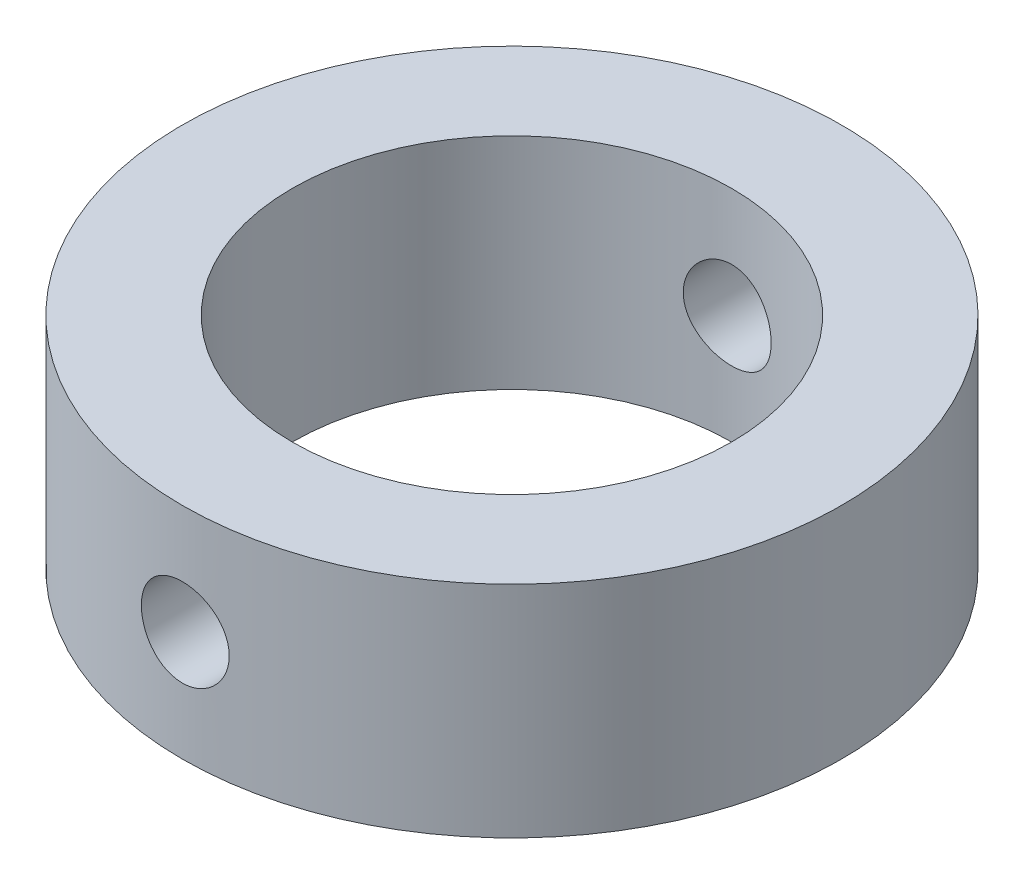
ISO-10303-21;
HEADER;
FILE_DESCRIPTION(('STEP AP214'),'2;1');
FILE_NAME('part.step','',(''),(''),'','','');
FILE_SCHEMA(('AUTOMOTIVE_DESIGN { 1 0 10303 214 1 1 1 1 }'));
ENDSEC;
DATA;
#1=APPLICATION_CONTEXT('core data for automotive mechanical design processes');
#2=APPLICATION_PROTOCOL_DEFINITION('international standard','automotive_design',2000,#1);
#3=PRODUCT_CONTEXT('',#1,'mechanical');
#4=PRODUCT('Part','Part','',(#3));
#5=PRODUCT_RELATED_PRODUCT_CATEGORY('part','',(#4));
#6=PRODUCT_DEFINITION_FORMATION('','',#4);
#7=PRODUCT_DEFINITION_CONTEXT('part definition',#1,'design');
#8=PRODUCT_DEFINITION('design','',#6,#7);
#9=PRODUCT_DEFINITION_SHAPE('','',#8);
#10=(LENGTH_UNIT() NAMED_UNIT(*) SI_UNIT(.MILLI.,.METRE.));
#11=(NAMED_UNIT(*) PLANE_ANGLE_UNIT() SI_UNIT($,.RADIAN.));
#12=(NAMED_UNIT(*) SI_UNIT($,.STERADIAN.) SOLID_ANGLE_UNIT());
#13=UNCERTAINTY_MEASURE_WITH_UNIT(LENGTH_MEASURE(1.E-05),#10,'distance_accuracy_value','');
#14=(GEOMETRIC_REPRESENTATION_CONTEXT(3) GLOBAL_UNCERTAINTY_ASSIGNED_CONTEXT((#13)) GLOBAL_UNIT_ASSIGNED_CONTEXT((#10,
#11,#12)) REPRESENTATION_CONTEXT('',''));
#15=CARTESIAN_POINT('',(0.,0.,0.));
#16=DIRECTION('',(0.,0.,1.));
#17=DIRECTION('',(1.,0.,0.));
#18=AXIS2_PLACEMENT_3D('',#15,#16,#17);
#19=CARTESIAN_POINT('',(0.,15.,0.));
#20=DIRECTION('',(0.,1.,0.));
#21=DIRECTION('',(0.,0.,1.));
#22=AXIS2_PLACEMENT_3D('',#19,#20,#21);
#23=PLANE('',#22);
#24=CARTESIAN_POINT('',(0.,15.,0.));
#25=DIRECTION('',(0.,1.,0.));
#26=DIRECTION('',(0.,0.,1.));
#27=AXIS2_PLACEMENT_3D('',#24,#25,#26);
#28=CIRCLE('',#27,22.5);
#29=CARTESIAN_POINT('',(0.,15.,22.5));
#30=VERTEX_POINT('',#29);
#31=EDGE_CURVE('E10',#30,#30,#28,.T.);
#32=ORIENTED_EDGE('',*,*,#31,.T.);
#33=EDGE_LOOP('',(#32));
#34=FACE_BOUND('',#33,.T.);
#35=CARTESIAN_POINT('',(0.,15.,0.));
#36=DIRECTION('',(0.,1.,0.));
#37=DIRECTION('',(0.,0.,1.));
#38=AXIS2_PLACEMENT_3D('',#35,#36,#37);
#39=CIRCLE('',#38,15.);
#40=CARTESIAN_POINT('',(0.,15.,15.));
#41=VERTEX_POINT('',#40);
#42=EDGE_CURVE('E56',#41,#41,#39,.T.);
#43=ORIENTED_EDGE('',*,*,#42,.F.);
#44=EDGE_LOOP('',(#43));
#45=FACE_BOUND('',#44,.T.);
#46=ADVANCED_FACE('F37',(#34,#45),#23,.T.);
#47=CARTESIAN_POINT('',(0.,0.,0.));
#48=DIRECTION('',(0.,1.,0.));
#49=DIRECTION('',(0.,0.,1.));
#50=AXIS2_PLACEMENT_3D('',#47,#48,#49);
#51=PLANE('',#50);
#52=CARTESIAN_POINT('',(0.,0.,0.));
#53=DIRECTION('',(0.,1.,0.));
#54=DIRECTION('',(0.,0.,1.));
#55=AXIS2_PLACEMENT_3D('',#52,#53,#54);
#56=CIRCLE('',#55,22.5);
#57=CARTESIAN_POINT('',(0.,0.,22.5));
#58=VERTEX_POINT('',#57);
#59=EDGE_CURVE('E51',#58,#58,#56,.T.);
#60=ORIENTED_EDGE('',*,*,#59,.F.);
#61=EDGE_LOOP('',(#60));
#62=FACE_BOUND('',#61,.T.);
#63=CARTESIAN_POINT('',(0.,0.,0.));
#64=DIRECTION('',(0.,1.,0.));
#65=DIRECTION('',(0.,0.,1.));
#66=AXIS2_PLACEMENT_3D('',#63,#64,#65);
#67=CIRCLE('',#66,15.);
#68=CARTESIAN_POINT('',(0.,0.,15.));
#69=VERTEX_POINT('',#68);
#70=EDGE_CURVE('E59',#69,#69,#67,.T.);
#71=ORIENTED_EDGE('',*,*,#70,.T.);
#72=EDGE_LOOP('',(#71));
#73=FACE_BOUND('',#72,.T.);
#74=ADVANCED_FACE('F95',(#62,#73),#51,.F.);
#75=CARTESIAN_POINT('',(0.,15.,0.));
#76=DIRECTION('',(0.,-1.,0.));
#77=DIRECTION('',(0.,0.,-1.));
#78=AXIS2_PLACEMENT_3D('',#75,#76,#77);
#79=CYLINDRICAL_SURFACE('',#78,22.5);
#80=CARTESIAN_POINT('',(0.,10.5,-22.5));
#81=CARTESIAN_POINT('',(-0.167713253503927,10.4999929354396,-22.4999975361382));
#82=CARTESIAN_POINT('',(-0.33552896891442,10.4858886930563,-22.4981050609079));
#83=CARTESIAN_POINT('',(-0.666484087707118,10.4298504764257,-22.4907376669036));
#84=CARTESIAN_POINT('',(-0.829618533499555,10.3878880576543,-22.4852590866258));
#85=CARTESIAN_POINT('',(-1.14637246894048,10.2773974236878,-22.471336197736));
#86=CARTESIAN_POINT('',(-1.29999852458774,10.2088877834423,-22.4628939631646));
#87=CARTESIAN_POINT('',(-1.59354584254545,10.0472896292906,-22.4439807999059));
#88=CARTESIAN_POINT('',(-1.73346930950554,9.95420507825031,-22.4335101983785));
#89=CARTESIAN_POINT('',(-1.99653873375702,9.74548010759372,-22.4116349218495));
#90=CARTESIAN_POINT('',(-2.1195869782438,9.62971703248729,-22.4002253724317));
#91=CARTESIAN_POINT('',(-2.34457103509653,9.37918471638502,-22.3777970633693));
#92=CARTESIAN_POINT('',(-2.44650572995832,9.24441447000629,-22.3667783244351));
#93=CARTESIAN_POINT('',(-2.62673853403361,8.95905131558245,-22.3463315316028));
#94=CARTESIAN_POINT('',(-2.70494411223867,8.80839947628206,-22.3369097664864));
#95=CARTESIAN_POINT('',(-2.83490767510935,8.49595339914482,-22.3207888106885));
#96=CARTESIAN_POINT('',(-2.88666679867917,8.33415964147003,-22.3140895027681));
#97=CARTESIAN_POINT('',(-2.96196910158261,8.00504128424751,-22.30421904853));
#98=CARTESIAN_POINT('',(-2.9856780634276,7.83775524820062,-22.301027180552));
#99=CARTESIAN_POINT('',(-3.00472020822176,7.50155073059107,-22.2984697741397));
#100=CARTESIAN_POINT('',(-3.00005468450402,7.33263232378365,-22.299104061306));
#101=CARTESIAN_POINT('',(-2.96261618908852,6.9991183049581,-22.3041083365948));
#102=CARTESIAN_POINT('',(-2.93002646297642,6.83450170517144,-22.3084539693351));
#103=CARTESIAN_POINT('',(-2.83795086951557,6.51309474485987,-22.3203532916212));
#104=CARTESIAN_POINT('',(-2.77846438892186,6.35630456286748,-22.3279070543119));
#105=CARTESIAN_POINT('',(-2.63408893714787,6.0544355479392,-22.3453989166654));
#106=CARTESIAN_POINT('',(-2.54912096870624,5.90939494320854,-22.3553444118585));
#107=CARTESIAN_POINT('',(-2.35625090016434,5.63556137712351,-22.376493543299));
#108=CARTESIAN_POINT('',(-2.24834760753577,5.50676926116875,-22.3876972449529));
#109=CARTESIAN_POINT('',(-2.01165735039543,5.26802548112715,-22.4102084885038));
#110=CARTESIAN_POINT('',(-1.88271256053967,5.15823023594651,-22.421516153118));
#111=CARTESIAN_POINT('',(-1.60814125520011,4.96181693260741,-22.4428788572739));
#112=CARTESIAN_POINT('',(-1.46251469166355,4.87519894121472,-22.4529338932073));
#113=CARTESIAN_POINT('',(-1.1585883295957,4.72759632345789,-22.4706659061537));
#114=CARTESIAN_POINT('',(-1.00028336826184,4.66662220343053,-22.4783419081343));
#115=CARTESIAN_POINT('',(-0.675556386504373,4.57216602154148,-22.4904423885611));
#116=CARTESIAN_POINT('',(-0.509134799313384,4.53868249404091,-22.4948670403489));
#117=CARTESIAN_POINT('',(-0.174250354988464,4.50036235084332,-22.4999436206528));
#118=CARTESIAN_POINT('',(-0.00581255182056182,4.49531039732477,-22.5006239077357));
#119=CARTESIAN_POINT('',(0.329507425828079,4.51342749619077,-22.4982118730778));
#120=CARTESIAN_POINT('',(0.496389638018499,4.53659586267354,-22.495119643029));
#121=CARTESIAN_POINT('',(0.823220573359409,4.61031698007598,-22.4855276303715));
#122=CARTESIAN_POINT('',(0.98319302476807,4.66076635248323,-22.4790407145438));
#123=CARTESIAN_POINT('',(1.29240764819034,4.78750944890563,-22.4633851388143));
#124=CARTESIAN_POINT('',(1.44164941052346,4.86380415901988,-22.4542163765916));
#125=CARTESIAN_POINT('',(1.72612331792412,5.04058823337497,-22.4341475605511));
#126=CARTESIAN_POINT('',(1.86126872159491,5.14121604857,-22.4232377256857));
#127=CARTESIAN_POINT('',(2.11282942048785,5.36361499383638,-22.4009359306497));
#128=CARTESIAN_POINT('',(2.22924386493568,5.48538708377465,-22.3895439486093));
#129=CARTESIAN_POINT('',(2.44080824134647,5.74756971395933,-22.3674735371027));
#130=CARTESIAN_POINT('',(2.53581491413408,5.88809635010724,-22.3568002316295));
#131=CARTESIAN_POINT('',(2.70087526618221,6.18323911542139,-22.3374619950273));
#132=CARTESIAN_POINT('',(2.7709295026552,6.33785492986557,-22.3287970190518));
#133=CARTESIAN_POINT('',(2.88386754751119,6.65633586304154,-22.3144921767012));
#134=CARTESIAN_POINT('',(2.92683043270193,6.82017252781621,-22.308843513489));
#135=CARTESIAN_POINT('',(2.98462000715938,7.15281544819314,-22.3011862304744));
#136=CARTESIAN_POINT('',(2.99944820140173,7.32162143748665,-22.2991774159701));
#137=CARTESIAN_POINT('',(3.00051728709284,7.65798523628026,-22.2990334694317));
#138=CARTESIAN_POINT('',(2.98698328791739,7.82554236144636,-22.3008678342378));
#139=CARTESIAN_POINT('',(2.93219065030034,8.15597681265581,-22.308137758113));
#140=CARTESIAN_POINT('',(2.89093202224903,8.31885414045297,-22.3135733158325));
#141=CARTESIAN_POINT('',(2.78193465498311,8.63526552487738,-22.3274233540915));
#142=CARTESIAN_POINT('',(2.71420831228562,8.78880391667529,-22.335836439891));
#143=CARTESIAN_POINT('',(2.55422014139606,9.08237382573909,-22.3546956856923));
#144=CARTESIAN_POINT('',(2.46195783945643,9.22240508213407,-22.365141884949));
#145=CARTESIAN_POINT('',(2.25468672764262,9.48613447489262,-22.3869895077459));
#146=CARTESIAN_POINT('',(2.13951040840351,9.6097004216327,-22.3983975863112));
#147=CARTESIAN_POINT('',(1.89003254024735,9.83583482454232,-22.4208257850249));
#148=CARTESIAN_POINT('',(1.75572651109466,9.93839834812538,-22.4318458135347));
#149=CARTESIAN_POINT('',(1.47112948177923,10.1200007076998,-22.4523095270629));
#150=CARTESIAN_POINT('',(1.32077193111594,10.1989359998329,-22.4617461964033));
#151=CARTESIAN_POINT('',(1.00888861438099,10.3303208978176,-22.4779098098846));
#152=CARTESIAN_POINT('',(0.847375018454831,10.3827988629373,-22.4846396538647));
#153=CARTESIAN_POINT('',(0.570882612147626,10.4474220095778,-22.493035826149));
#154=CARTESIAN_POINT('',(0.457636622933667,10.4671098652855,-22.4956344545261));
#155=CARTESIAN_POINT('',(0.229609757424167,10.4934012212482,-22.4991173773616));
#156=CARTESIAN_POINT('',(0.11482889467686,10.5000048369204,-22.500001686942));
#157=CARTESIAN_POINT('',(0.,10.5,-22.5));
#158=B_SPLINE_CURVE_WITH_KNOTS('',3,(#80,#81,#82,#83,#84,#85,#86,#87,#88,#89,#90,#91,#92,#93,
#94,#95,#96,#97,#98,#99,#100,#101,#102,#103,#104,#105,#106,#107,#108,#109,#110,#111,#112,#113,
#114,#115,#116,#117,#118,#119,#120,#121,#122,#123,#124,#125,#126,#127,#128,#129,#130,#131,#132,
#133,#134,#135,#136,#137,#138,#139,#140,#141,#142,#143,#144,#145,#146,#147,#148,#149,#150,#151,
#152,#153,#154,#155,#156,#157),.UNSPECIFIED.,.T.,.F.,(4,2,2,2,2,2,2,2,2,2,2,2,2,2,2,2,2,2,2,2,2,
2,2,2,2,2,2,2,2,2,2,2,2,2,2,2,2,2,4),(0.,0.502720276958615,1.00595464632757,1.50883753924111,
2.01163938846052,2.51723967665338,3.02286671857254,3.53044082267472,4.03799306649307,
4.54253033871538,5.0470446138738,5.54827327647065,6.04951336763776,6.55232374706847,
7.05516027665696,7.56195816727274,8.06875751778444,8.57576430303808,9.08274405587614,
9.58587877488091,10.0890012653172,10.590230450947,11.0914787625532,11.5956491215483,
12.0998423738814,12.6073155680318,13.1147774290957,13.6207511210318,14.1266977467545,
14.6286439124494,15.1305898900312,15.6323010555393,16.1340219089385,16.6395550175266,
17.1452067187674,17.6530429001177,18.1603335748863,18.5045360857096,18.8487355602816),.UNSPECIFIED.);
#159=CARTESIAN_POINT('',(0.,10.5,-22.5));
#160=VERTEX_POINT('',#159);
#161=EDGE_CURVE('E84',#160,#160,#158,.T.);
#162=ORIENTED_EDGE('',*,*,#161,.T.);
#163=EDGE_LOOP('',(#162));
#164=FACE_BOUND('',#163,.T.);
#165=CARTESIAN_POINT('',(3.,7.5,22.2991031209778));
#166=CARTESIAN_POINT('',(2.99999292892183,7.33229421679777,22.2991056676806));
#167=CARTESIAN_POINT('',(2.98588990056203,7.16448595032542,22.3010154696116));
#168=CARTESIAN_POINT('',(2.92985694399183,6.83354630649641,22.3084447289533));
#169=CARTESIAN_POINT('',(2.88789854473666,6.67041989262426,22.3139678794925));
#170=CARTESIAN_POINT('',(2.77741966710399,6.35368294766046,22.3279873821811));
#171=CARTESIAN_POINT('',(2.70891795412568,6.20006578257344,22.3364816334313));
#172=CARTESIAN_POINT('',(2.54733847321029,5.90653338643568,22.3554837337772));
#173=CARTESIAN_POINT('',(2.45426464895203,5.76661596159296,22.3659912596801));
#174=CARTESIAN_POINT('',(2.24555055734277,5.50353981799729,22.3879106598111));
#175=CARTESIAN_POINT('',(2.12978523412289,5.38048070148092,22.399327327406));
#176=CARTESIAN_POINT('',(1.87924384308915,5.15547563181543,22.4217356438735));
#177=CARTESIAN_POINT('',(1.74446679970797,5.05353076278571,22.4327272708986));
#178=CARTESIAN_POINT('',(1.45909758739142,4.87328723742539,22.4530964964055));
#179=CARTESIAN_POINT('',(1.30844765656683,4.79507926606463,22.4624678475342));
#180=CARTESIAN_POINT('',(0.996005724056049,4.6651107537288,22.4784878012371));
#181=CARTESIAN_POINT('',(0.8342141908836,4.61334910143348,22.4851365182189));
#182=CARTESIAN_POINT('',(0.505103062521133,4.5380416356296,22.4949282929341));
#183=CARTESIAN_POINT('',(0.337822085204846,4.51432977748206,22.4980919730761));
#184=CARTESIAN_POINT('',(0.00162750345548431,4.49528008689477,22.5006277195727));
#185=CARTESIAN_POINT('',(-0.167286028083699,4.49994099339522,22.4999999544424));
#186=CARTESIAN_POINT('',(-0.500820186698654,4.53737209581142,22.4950401617536));
#187=CARTESIAN_POINT('',(-0.665461256042677,4.56996369711847,22.4907316700671));
#188=CARTESIAN_POINT('',(-0.986916184068833,4.66205149053226,22.4789208613843));
#189=CARTESIAN_POINT('',(-1.14372987681276,4.72154825275217,22.4714184767105));
#190=CARTESIAN_POINT('',(-1.44562771263619,4.86594516168273,22.4540222850625));
#191=CARTESIAN_POINT('',(-1.59067477402989,4.95092193477462,22.4441212821882));
#192=CARTESIAN_POINT('',(-1.86451753610218,5.14381088592428,22.4230342562856));
#193=CARTESIAN_POINT('',(-1.99331238880023,5.2517242599417,22.4118481662643));
#194=CARTESIAN_POINT('',(-2.23204509231808,5.4884217725384,22.3893388214349));
#195=CARTESIAN_POINT('',(-2.34182855029532,5.61736165229045,22.378015176366));
#196=CARTESIAN_POINT('',(-2.53822039585787,5.89191889705886,22.3565924815386));
#197=CARTESIAN_POINT('',(-2.6248286915453,6.03753632820445,22.3464934366361));
#198=CARTESIAN_POINT('',(-2.7724242912975,6.34146000052005,22.3286636450151));
#199=CARTESIAN_POINT('',(-2.8333981336006,6.49977285677773,22.3209341432218));
#200=CARTESIAN_POINT('',(-2.92785135067386,6.82451703095756,22.3087421319858));
#201=CARTESIAN_POINT('',(-2.96133224031215,6.99094790103985,22.3042794425424));
#202=CARTESIAN_POINT('',(-2.9996424115309,7.32583700250744,22.2991596751552));
#203=CARTESIAN_POINT('',(-3.00468946648218,7.4942698954988,22.2984736726744));
#204=CARTESIAN_POINT('',(-2.98656432283194,7.82957888415711,22.3009083644505));
#205=CARTESIAN_POINT('',(-2.96339281094665,7.99645501760918,22.3040289660712));
#206=CARTESIAN_POINT('',(-2.88967207555529,8.32325397960842,22.3136988065515));
#207=CARTESIAN_POINT('',(-2.8392292548504,8.48320123952715,22.3202347168148));
#208=CARTESIAN_POINT('',(-2.71250767620188,8.79236837017865,22.3359878852161));
#209=CARTESIAN_POINT('',(-2.63622789314075,8.94158781498558,22.3452052497426));
#210=CARTESIAN_POINT('',(-2.45946609625816,9.22604596566122,22.3653516992928));
#211=CARTESIAN_POINT('',(-2.35884184749451,9.36119557255235,22.376290706837));
#212=CARTESIAN_POINT('',(-2.13644748469198,9.61276640765563,22.3986171527477));
#213=CARTESIAN_POINT('',(-2.01467643215631,9.72918680422202,22.410004610999));
#214=CARTESIAN_POINT('',(-1.75249132253736,9.94076483088168,22.43203422983));
#215=CARTESIAN_POINT('',(-1.61196096139879,10.0357789745574,22.4426710507457));
#216=CARTESIAN_POINT('',(-1.31680867847643,10.200852423263,22.4619201221745));
#217=CARTESIAN_POINT('',(-1.16218707377055,10.2709122896342,22.4705324182274));
#218=CARTESIAN_POINT('',(-0.843709158785151,10.3838538923822,22.4847384703673));
#219=CARTESIAN_POINT('',(-0.679882176371044,10.4268171436253,22.4903412723117));
#220=CARTESIAN_POINT('',(-0.347259740134797,10.4846107281915,22.4979347502993));
#221=CARTESIAN_POINT('',(-0.178464543299733,10.4994425140616,22.499925612842));
#222=CARTESIAN_POINT('',(0.157904810567379,10.5005224008605,22.5000697087261));
#223=CARTESIAN_POINT('',(0.325478288882809,10.4869912058916,22.4982525737009));
#224=CARTESIAN_POINT('',(0.655946164578539,10.432198438152,22.4910439982984));
#225=CARTESIAN_POINT('',(0.81884056851161,10.390936904218,22.485652562927));
#226=CARTESIAN_POINT('',(1.13528735188325,10.2819269293851,22.4718983496352));
#227=CARTESIAN_POINT('',(1.28884395231571,10.2141905603882,22.4635369261179));
#228=CARTESIAN_POINT('',(1.58244611794646,10.0541766755311,22.4447662409466));
#229=CARTESIAN_POINT('',(1.72249143359931,9.96189870652016,22.4343569414803));
#230=CARTESIAN_POINT('',(1.98622092909954,9.75460997699573,22.4125543681221));
#231=CARTESIAN_POINT('',(2.10977573574388,9.63943531479568,22.4011543544026));
#232=CARTESIAN_POINT('',(2.33588843381036,9.38996539642449,22.3787079735476));
#233=CARTESIAN_POINT('',(2.43844136296137,9.25566563410142,22.3676616905097));
#234=CARTESIAN_POINT('',(2.62003186467116,8.97107408765783,22.3471216479154));
#235=CARTESIAN_POINT('',(2.69896410641011,8.82071461279206,22.337634925064));
#236=CARTESIAN_POINT('',(2.83034277419568,8.50882729878187,22.3213704974611));
#237=CARTESIAN_POINT('',(2.88281759498929,8.34731164537562,22.3145898900774));
#238=CARTESIAN_POINT('',(2.94743220568238,8.07082758190417,22.3061270075485));
#239=CARTESIAN_POINT('',(2.96711622203802,7.95759259054575,22.3035064293224));
#240=CARTESIAN_POINT('',(2.99340248014674,7.72958773579628,22.2999936221278));
#241=CARTESIAN_POINT('',(3.00000484113448,7.61481788640452,22.2991013774062));
#242=CARTESIAN_POINT('',(3.,7.5,22.2991031209778));
#243=B_SPLINE_CURVE_WITH_KNOTS('',3,(#165,#166,#167,#168,#169,#170,#171,#172,#173,#174,#175,
#176,#177,#178,#179,#180,#181,#182,#183,#184,#185,#186,#187,#188,#189,#190,#191,#192,#193,#194,
#195,#196,#197,#198,#199,#200,#201,#202,#203,#204,#205,#206,#207,#208,#209,#210,#211,#212,#213,
#214,#215,#216,#217,#218,#219,#220,#221,#222,#223,#224,#225,#226,#227,#228,#229,#230,#231,#232,
#233,#234,#235,#236,#237,#238,#239,#240,#241,#242),.UNSPECIFIED.,.T.,.F.,(4,2,2,2,2,2,2,2,2,2,2,
2,2,2,2,2,2,2,2,2,2,2,2,2,2,2,2,2,2,2,2,2,2,2,2,2,2,2,4),(0.,0.502697833875675,1.00591026915852,
1.50876759415237,2.01154426252435,2.51717392681748,3.02282954643357,3.5303933478772,
4.03793581885392,4.54245854287453,5.04695884297285,5.54825713004929,6.04956604000018,
6.55239792684377,7.05525603876943,7.56202372603438,8.06879342278637,8.57582891483612,
9.08283646723653,9.58595553872895,10.0890623667531,10.5902202722789,11.0913980642731,
11.595577922135,12.0997801612593,12.6072676764676,13.1147437751273,13.620685856555,
14.1266018133322,14.6285956478445,15.1305887793096,15.6323532802529,16.1341270467162,
16.6396311355341,17.145254526141,17.6531001297407,18.1603995347189,18.5045691141841,
18.8487355566505),.UNSPECIFIED.);
#244=CARTESIAN_POINT('',(3.,7.5,22.2991031209778));
#245=VERTEX_POINT('',#244);
#246=EDGE_CURVE('E79',#245,#245,#243,.T.);
#247=ORIENTED_EDGE('',*,*,#246,.T.);
#248=EDGE_LOOP('',(#247));
#249=FACE_BOUND('',#248,.T.);
#250=ORIENTED_EDGE('',*,*,#31,.F.);
#251=EDGE_LOOP('',(#250));
#252=FACE_BOUND('',#251,.T.);
#253=ORIENTED_EDGE('',*,*,#59,.T.);
#254=EDGE_LOOP('',(#253));
#255=FACE_BOUND('',#254,.T.);
#256=ADVANCED_FACE('F39',(#164,#249,#252,#255),#79,.T.);
#257=CARTESIAN_POINT('',(0.,15.,0.));
#258=DIRECTION('',(0.,-1.,0.));
#259=DIRECTION('',(0.,0.,-1.));
#260=AXIS2_PLACEMENT_3D('',#257,#258,#259);
#261=CYLINDRICAL_SURFACE('',#260,15.);
#262=CARTESIAN_POINT('',(0.,10.5,-15.));
#263=CARTESIAN_POINT('',(-0.1667307203779,10.499993866505,-14.9999969274261));
#264=CARTESIAN_POINT('',(-0.333538980604567,10.4860534710971,-14.9971915553469));
#265=CARTESIAN_POINT('',(-0.662440523067058,10.4307044996543,-14.9862709686969));
#266=CARTESIAN_POINT('',(-0.824529952624068,10.3892741015955,-14.9781515358056));
#267=CARTESIAN_POINT('',(-1.13919091578994,10.2802761791376,-14.9575094783486));
#268=CARTESIAN_POINT('',(-1.2917714037994,10.2127336894659,-14.9449910723015));
#269=CARTESIAN_POINT('',(-1.58342396659268,10.0535032574661,-14.9169119410594));
#270=CARTESIAN_POINT('',(-1.72249684522744,9.96181675317838,-14.9013513970712));
#271=CARTESIAN_POINT('',(-1.9850804319446,9.7555845171257,-14.8686649598991));
#272=CARTESIAN_POINT('',(-2.10838185347557,9.64077493382639,-14.8515223651304));
#273=CARTESIAN_POINT('',(-2.33411026982409,9.39212275082489,-14.8177254135776));
#274=CARTESIAN_POINT('',(-2.43653563431127,9.25827866599464,-14.8010710950127));
#275=CARTESIAN_POINT('',(-2.61849526004286,8.97385142096437,-14.7699732543785));
#276=CARTESIAN_POINT('',(-2.6978128165976,8.82312706861092,-14.7555512209484));
#277=CARTESIAN_POINT('',(-2.82991699974092,8.51015454298776,-14.7307880417525));
#278=CARTESIAN_POINT('',(-2.88270624731171,8.34790750996097,-14.7204464928588));
#279=CARTESIAN_POINT('',(-2.95957589965448,8.01874690827625,-14.7051841575661));
#280=CARTESIAN_POINT('',(-2.98402349387633,7.85192236757332,-14.7001941032156));
#281=CARTESIAN_POINT('',(-3.00465638317836,7.51647053590697,-14.6959912518188));
#282=CARTESIAN_POINT('',(-3.0008445681405,7.34784343103956,-14.6967778640352));
#283=CARTESIAN_POINT('',(-2.96536371930546,7.01625963593699,-14.7039765344455));
#284=CARTESIAN_POINT('',(-2.93411562073172,6.85325578311806,-14.7103035857629));
#285=CARTESIAN_POINT('',(-2.84531365386915,6.53485177001099,-14.7277363848));
#286=CARTESIAN_POINT('',(-2.78775852930204,6.37945197324298,-14.7388423607334));
#287=CARTESIAN_POINT('',(-2.64757435102416,6.0794542148892,-14.7646685550122));
#288=CARTESIAN_POINT('',(-2.56477845369634,5.93493636129248,-14.7794126944111));
#289=CARTESIAN_POINT('',(-2.37658072371804,5.66168745008156,-14.8108385631919));
#290=CARTESIAN_POINT('',(-2.27117629307049,5.53295820944653,-14.827520515151));
#291=CARTESIAN_POINT('',(-2.03849980368175,5.29251179262919,-14.8613106372439));
#292=CARTESIAN_POINT('',(-1.91086848363733,5.18114229642261,-14.8784210763271));
#293=CARTESIAN_POINT('',(-1.63855507218603,4.98133846109633,-14.9108654614323));
#294=CARTESIAN_POINT('',(-1.49387276213817,4.89290441611926,-14.9261993846692));
#295=CARTESIAN_POINT('',(-1.19117816063676,4.74141747232207,-14.9534007048266));
#296=CARTESIAN_POINT('',(-1.0331454587559,4.67840431906639,-14.9652626654482));
#297=CARTESIAN_POINT('',(-0.708446929345993,4.5799185778843,-14.9841422696357));
#298=CARTESIAN_POINT('',(-0.541782150217349,4.54444265377912,-14.9911605000159));
#299=CARTESIAN_POINT('',(-0.207538216881451,4.50253063861717,-14.999480156006));
#300=CARTESIAN_POINT('',(-0.0400209849767287,4.49561874137919,-15.0008752395741));
#301=CARTESIAN_POINT('',(0.293774802578142,4.50974957682654,-14.9980515579031));
#302=CARTESIAN_POINT('',(0.46005342733138,4.53079073805779,-14.9938331082434));
#303=CARTESIAN_POINT('',(0.785116979839623,4.59983512063187,-14.9803149602405));
#304=CARTESIAN_POINT('',(0.943955845019709,4.64759420549371,-14.9710612921262));
#305=CARTESIAN_POINT('',(1.251370882499,4.76845194796743,-14.948506561831));
#306=CARTESIAN_POINT('',(1.39994628491262,4.84155250403049,-14.9352051964268));
#307=CARTESIAN_POINT('',(1.68462352105865,5.01204747195394,-14.9057973459988));
#308=CARTESIAN_POINT('',(1.82055038025656,5.10972834311683,-14.8896585131116));
#309=CARTESIAN_POINT('',(2.07425405735762,5.32622757362184,-14.8564420448965));
#310=CARTESIAN_POINT('',(2.19202892679229,5.4450481991996,-14.8393643090516));
#311=CARTESIAN_POINT('',(2.40792177232253,5.70262005567337,-14.8058791067089));
#312=CARTESIAN_POINT('',(2.50571310734597,5.84164723266401,-14.7894858069991));
#313=CARTESIAN_POINT('',(2.67655626015362,6.13443408407004,-14.7595257538858));
#314=CARTESIAN_POINT('',(2.74960906776871,6.28819316872066,-14.7459588874003));
#315=CARTESIAN_POINT('',(2.86845552474588,6.60530473844865,-14.7233022175315));
#316=CARTESIAN_POINT('',(2.91439049937315,6.76860252363096,-14.7141892461656));
#317=CARTESIAN_POINT('',(2.97812595488159,7.10080036047272,-14.7014231037608));
#318=CARTESIAN_POINT('',(2.99593010467534,7.26969967862804,-14.6977692207333));
#319=CARTESIAN_POINT('',(3.00276273260241,7.60502659363295,-14.6963744889414));
#320=CARTESIAN_POINT('',(2.99230736421269,7.77144344678103,-14.698527575679));
#321=CARTESIAN_POINT('',(2.94405691230018,8.10009494971508,-14.7082672045384));
#322=CARTESIAN_POINT('',(2.90626204838789,8.26232963308441,-14.7158537030151));
#323=CARTESIAN_POINT('',(2.80463570549686,8.57768313372163,-14.7355579265748));
#324=CARTESIAN_POINT('',(2.74086752015203,8.73082308150725,-14.7476646305649));
#325=CARTESIAN_POINT('',(2.58916393380481,9.02431116220332,-14.7750514492251));
#326=CARTESIAN_POINT('',(2.50122650632465,9.16465822117541,-14.7903318299668));
#327=CARTESIAN_POINT('',(2.30191774435924,9.43114671645094,-14.8226688156968));
#328=CARTESIAN_POINT('',(2.19017366170554,9.55700629580279,-14.839751187291));
#329=CARTESIAN_POINT('',(1.94719310703942,9.78835861658751,-14.8735824561586));
#330=CARTESIAN_POINT('',(1.81595216146,9.89384667095182,-14.8903312758955));
#331=CARTESIAN_POINT('',(1.53605288726474,10.0825039318393,-14.9218149716391));
#332=CARTESIAN_POINT('',(1.3872266532895,10.1654280098401,-14.9365269365774));
#333=CARTESIAN_POINT('',(1.0774990828222,10.3049583677898,-14.96205375255));
#334=CARTESIAN_POINT('',(0.916608782589378,10.3615883685975,-14.9728721141585));
#335=CARTESIAN_POINT('',(0.629464466771338,10.4359558441341,-14.9872911778611));
#336=CARTESIAN_POINT('',(0.504844992041354,10.4599295811233,-14.9920290947535));
#337=CARTESIAN_POINT('',(0.253498575630201,10.4919537370751,-14.9983846241968));
#338=CARTESIAN_POINT('',(0.126771701245857,10.5000046635293,-15.0000023361946));
#339=CARTESIAN_POINT('',(0.,10.5,-15.));
#340=B_SPLINE_CURVE_WITH_KNOTS('',3,(#262,#263,#264,#265,#266,#267,#268,#269,#270,#271,#272,
#273,#274,#275,#276,#277,#278,#279,#280,#281,#282,#283,#284,#285,#286,#287,#288,#289,#290,#291,
#292,#293,#294,#295,#296,#297,#298,#299,#300,#301,#302,#303,#304,#305,#306,#307,#308,#309,#310,
#311,#312,#313,#314,#315,#316,#317,#318,#319,#320,#321,#322,#323,#324,#325,#326,#327,#328,#329,
#330,#331,#332,#333,#334,#335,#336,#337,#338,#339),.UNSPECIFIED.,.T.,.F.,(4,2,2,2,2,2,2,2,2,2,2,
2,2,2,2,2,2,2,2,2,2,2,2,2,2,2,2,2,2,2,2,2,2,2,2,2,2,2,4),(0.,0.499728391983776,0.99985395207397,
1.49950120575103,1.99911870669259,2.50479801033656,3.0105167902421,3.52083585017768,
4.03110448095592,4.53468555310762,5.03821512843675,5.53415181018835,6.03011217761189,
6.52942470610778,7.02879464249011,7.53714757474052,8.04550702619461,8.55465824562072,
9.06374777094108,9.56432207028795,10.064868229736,10.5609136185217,11.0569961764807,
11.5591519810008,12.0613616503779,12.5712188573768,13.081055661704,13.5882114309817,
14.0953010499124,14.593191677031,15.0910783047783,15.5877588375933,16.084481027456,
16.5896422871743,17.0949196359879,17.6054849002691,18.1155886655256,18.4955632586968,
18.8755257411299),.UNSPECIFIED.);
#341=CARTESIAN_POINT('',(0.,10.5,-15.));
#342=VERTEX_POINT('',#341);
#343=EDGE_CURVE('E42',#342,#342,#340,.T.);
#344=ORIENTED_EDGE('',*,*,#343,.F.);
#345=EDGE_LOOP('',(#344));
#346=FACE_BOUND('',#345,.T.);
#347=CARTESIAN_POINT('',(3.,7.5,14.6969384566991));
#348=CARTESIAN_POINT('',(2.99999383762581,7.33330687352653,14.6969417707994));
#349=CARTESIAN_POINT('',(2.98605951515443,7.16653612999998,14.6998052480611));
#350=CARTESIAN_POINT('',(2.93073685074852,6.8377124845706,14.7109329391462));
#351=CARTESIAN_POINT('',(2.88932654121148,6.67566346609206,14.7192014743436));
#352=CARTESIAN_POINT('',(2.78038734785924,6.36108808993737,14.7401662116556));
#353=CARTESIAN_POINT('',(2.71288444245786,6.20855243540223,14.7528580086323));
#354=CARTESIAN_POINT('',(2.55374732301151,5.91697546590913,14.7812339844198));
#355=CARTESIAN_POINT('',(2.46211445580345,5.77793339838629,14.7969179962038));
#356=CARTESIAN_POINT('',(2.25593722696031,5.51531698843842,14.8297589908276));
#357=CARTESIAN_POINT('',(2.14111696773996,5.39196123634808,14.8469321351174));
#358=CARTESIAN_POINT('',(1.89242036706393,5.16612739926306,14.880674169078));
#359=CARTESIAN_POINT('',(1.75854269093395,5.06365077774842,14.8972430163249));
#360=CARTESIAN_POINT('',(1.47408406777277,4.88163594711462,14.9280838925269));
#361=CARTESIAN_POINT('',(1.32336770301663,4.80230545855008,14.9423346432465));
#362=CARTESIAN_POINT('',(1.01041245116182,4.67017518885559,14.9667521065089));
#363=CARTESIAN_POINT('',(0.84817464426166,4.61737292429703,14.9769192013236));
#364=CARTESIAN_POINT('',(0.519050319835484,4.54047841914113,14.9919096206526));
#365=CARTESIAN_POINT('',(0.352253217644444,4.51601706728698,14.9968015886438));
#366=CARTESIAN_POINT('',(0.0168557053126103,4.49534714448505,15.0009276355081));
#367=CARTESIAN_POINT('',(-0.151744529495528,4.49913585106253,15.0001622595828));
#368=CARTESIAN_POINT('',(-0.483426002230765,4.53457854064666,14.9931130460555));
#369=CARTESIAN_POINT('',(-0.646551642895409,4.56583493150354,14.9869079509751));
#370=CARTESIAN_POINT('',(-0.965194879740902,4.65469509737668,14.9697653147823));
#371=CARTESIAN_POINT('',(-1.12071217124139,4.71229992657562,14.9588275843212));
#372=CARTESIAN_POINT('',(-1.42085838960266,4.8525901204418,14.9333188805988));
#373=CARTESIAN_POINT('',(-1.5654125224017,4.93543125331466,14.9187254452567));
#374=CARTESIAN_POINT('',(-1.83871513757927,5.1237272317098,14.8875140842136));
#375=CARTESIAN_POINT('',(-1.967461798575,5.22918467931155,14.8708959256567));
#376=CARTESIAN_POINT('',(-2.20785429316037,5.46190086632542,14.8371289309338));
#377=CARTESIAN_POINT('',(-2.31916294972089,5.58950756018877,14.8199758937255));
#378=CARTESIAN_POINT('',(-2.51885547953042,5.86174932735226,14.7873471479628));
#379=CARTESIAN_POINT('',(-2.60723891918325,6.00638472264959,14.7718714711364));
#380=CARTESIAN_POINT('',(-2.75868844440564,6.30906249546541,14.7443414241877));
#381=CARTESIAN_POINT('',(-2.82169994333313,6.46713290291899,14.7322944469065));
#382=CARTESIAN_POINT('',(-2.92017102488275,6.79191397117197,14.7130942896382));
#383=CARTESIAN_POINT('',(-2.95563419836993,6.95862350285725,14.7059404718528));
#384=CARTESIAN_POINT('',(-2.99749801810815,7.29289457399713,14.6974643780348));
#385=CARTESIAN_POINT('',(-3.00438557669374,7.46039272293102,14.6960444117146));
#386=CARTESIAN_POINT('',(-2.99021288493222,7.79414466959905,14.6989345706656));
#387=CARTESIAN_POINT('',(-2.96915421936733,7.96039853735659,14.7032443710116));
#388=CARTESIAN_POINT('',(-2.90010662422247,8.28530592087671,14.7170169748474));
#389=CARTESIAN_POINT('',(-2.8523778625179,8.44401702910729,14.7264299704349));
#390=CARTESIAN_POINT('',(-2.73162310592555,8.75118983708622,14.7493046805499));
#391=CARTESIAN_POINT('',(-2.65859502711953,8.89965069130716,14.7627667285881));
#392=CARTESIAN_POINT('',(-2.48821242664679,9.18423932985048,14.7924421788612));
#393=CARTESIAN_POINT('',(-2.39055323394826,9.32018113890248,14.8086891559471));
#394=CARTESIAN_POINT('',(-2.17408671663814,9.57392493600275,14.8420117147991));
#395=CARTESIAN_POINT('',(-2.05527721543361,9.69172505474776,14.8590873817145));
#396=CARTESIAN_POINT('',(-1.79769682049367,9.90768767755673,14.8924603760765));
#397=CARTESIAN_POINT('',(-1.65864749678889,10.00552096395,14.9087417312605));
#398=CARTESIAN_POINT('',(-1.36580368990427,10.1764376444988,14.9384138288586));
#399=CARTESIAN_POINT('',(-1.21200982630052,10.2495220780343,14.9518046926563));
#400=CARTESIAN_POINT('',(-0.894908042472039,10.3683866152399,14.974118821832));
#401=CARTESIAN_POINT('',(-0.731660020434236,10.4143215546788,14.9830673742781));
#402=CARTESIAN_POINT('',(-0.399568364039737,10.4780737429915,14.9955970781298));
#403=CARTESIAN_POINT('',(-0.230725406133636,10.495894378427,14.9991788759955));
#404=CARTESIAN_POINT('',(0.104618681710862,10.5027809428887,15.0005562136234));
#405=CARTESIAN_POINT('',(0.27110943642448,10.4923418413687,14.9984513564799));
#406=CARTESIAN_POINT('',(0.599913093946948,10.4440981483565,14.9889013068102));
#407=CARTESIAN_POINT('',(0.762226049261166,10.4062939009556,14.9814561814329));
#408=CARTESIAN_POINT('',(1.07775824923519,10.3046130237252,14.9620649509476));
#409=CARTESIAN_POINT('',(1.23099732972049,10.2407958656071,14.9501291174284));
#410=CARTESIAN_POINT('',(1.52466366055821,10.0889632760067,14.9230416637104));
#411=CARTESIAN_POINT('',(1.66508989730354,10.0009459322865,14.9078897894096));
#412=CARTESIAN_POINT('',(1.93159167031775,9.80154183881615,14.8757279747022));
#413=CARTESIAN_POINT('',(2.05739914834453,9.68980099084868,14.858692002537));
#414=CARTESIAN_POINT('',(2.28864785327552,9.44684927970369,14.8248366872359));
#415=CARTESIAN_POINT('',(2.39408424962674,9.31563381156023,14.8080173963616));
#416=CARTESIAN_POINT('',(2.58267665834994,9.03576204992871,14.7763002820179));
#417=CARTESIAN_POINT('',(2.66558044385427,8.88693311663624,14.7614251071368));
#418=CARTESIAN_POINT('',(2.80507214779868,8.5772016802197,14.7355571137924));
#419=CARTESIAN_POINT('',(2.86168393792249,8.41631028393843,14.7245607757495));
#420=CARTESIAN_POINT('',(2.93600741957297,8.12921263367138,14.7098904341354));
#421=CARTESIAN_POINT('',(2.95996169557105,8.00464374145813,14.7050635474382));
#422=CARTESIAN_POINT('',(2.99196005387913,7.75339813634659,14.6985863537725));
#423=CARTESIAN_POINT('',(3.00000468468793,7.62672149626659,14.6969359372925));
#424=CARTESIAN_POINT('',(3.,7.5,14.6969384566991));
#425=B_SPLINE_CURVE_WITH_KNOTS('',3,(#347,#348,#349,#350,#351,#352,#353,#354,#355,#356,#357,
#358,#359,#360,#361,#362,#363,#364,#365,#366,#367,#368,#369,#370,#371,#372,#373,#374,#375,#376,
#377,#378,#379,#380,#381,#382,#383,#384,#385,#386,#387,#388,#389,#390,#391,#392,#393,#394,#395,
#396,#397,#398,#399,#400,#401,#402,#403,#404,#405,#406,#407,#408,#409,#410,#411,#412,#413,#414,
#415,#416,#417,#418,#419,#420,#421,#422,#423,#424),.UNSPECIFIED.,.T.,.F.,(4,2,2,2,2,2,2,2,2,2,2,
2,2,2,2,2,2,2,2,2,2,2,2,2,2,2,2,2,2,2,2,2,2,2,2,2,2,2,4),(0.,0.499615391608283,
0.999630717852889,1.49914949382176,1.99864039457959,2.5044675764531,3.01033020106266,
3.5206020131235,4.03082604739679,4.53432746649241,5.03778036348745,5.53406368900612,
6.03036687221251,6.52979772666909,7.02928607310198,7.5374804028745,8.04568434368161,
8.5549758951833,9.06420105048074,9.5647127341378,10.0651960358526,10.5608802534996,
11.0566053106319,11.5587917932356,12.0610299861063,12.5709780520035,13.0809046989031,
13.5878944073595,14.0948230407488,14.5929305224406,15.0910317410027,15.5880005122636,
16.0850085640405,16.5900345607679,17.0951801666934,17.6057669573882,18.1158892527059,
18.4957141091448,18.8755258705644),.UNSPECIFIED.);
#426=CARTESIAN_POINT('',(3.,7.5,14.6969384566991));
#427=VERTEX_POINT('',#426);
#428=EDGE_CURVE('E61',#427,#427,#425,.T.);
#429=ORIENTED_EDGE('',*,*,#428,.F.);
#430=EDGE_LOOP('',(#429));
#431=FACE_BOUND('',#430,.T.);
#432=ORIENTED_EDGE('',*,*,#42,.T.);
#433=EDGE_LOOP('',(#432));
#434=FACE_BOUND('',#433,.T.);
#435=ORIENTED_EDGE('',*,*,#70,.F.);
#436=EDGE_LOOP('',(#435));
#437=FACE_BOUND('',#436,.T.);
#438=ADVANCED_FACE('F66',(#346,#431,#434,#437),#261,.F.);
#439=CARTESIAN_POINT('',(0.,7.5,-30.));
#440=DIRECTION('',(0.,0.,1.));
#441=DIRECTION('',(1.,0.,0.));
#442=AXIS2_PLACEMENT_3D('',#439,#440,#441);
#443=CYLINDRICAL_SURFACE('',#442,3.);
#444=ORIENTED_EDGE('',*,*,#428,.T.);
#445=EDGE_LOOP('',(#444));
#446=FACE_BOUND('',#445,.T.);
#447=ORIENTED_EDGE('',*,*,#246,.F.);
#448=EDGE_LOOP('',(#447));
#449=FACE_BOUND('',#448,.T.);
#450=ADVANCED_FACE('F72',(#446,#449),#443,.F.);
#451=ORIENTED_EDGE('',*,*,#343,.T.);
#452=EDGE_LOOP('',(#451));
#453=FACE_BOUND('',#452,.T.);
#454=ORIENTED_EDGE('',*,*,#161,.F.);
#455=EDGE_LOOP('',(#454));
#456=FACE_BOUND('',#455,.T.);
#457=ADVANCED_FACE('F69',(#453,#456),#443,.F.);
#458=CLOSED_SHELL('',(#46,#74,#256,#438,#450,#457));
#459=MANIFOLD_SOLID_BREP('B2',#458);
#460=ADVANCED_BREP_SHAPE_REPRESENTATION('',(#18,#459),#14);
#461=SHAPE_DEFINITION_REPRESENTATION(#9,#460);
ENDSEC;
END-ISO-10303-21;
